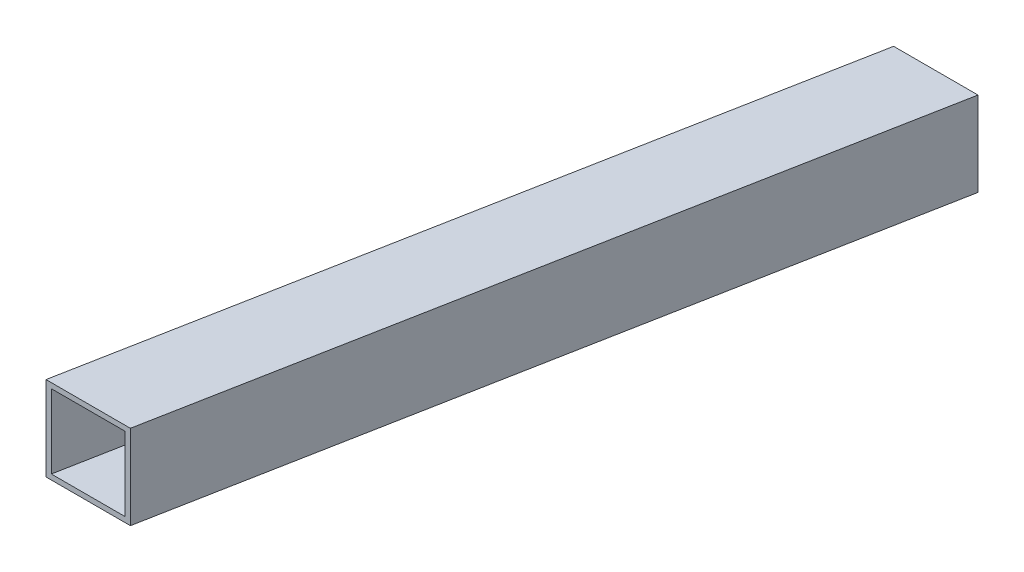
ISO-10303-21;
HEADER;
FILE_DESCRIPTION(('STEP AP214'),'2;1');
FILE_NAME('part.step','',(''),(''),'','','');
FILE_SCHEMA(('AUTOMOTIVE_DESIGN { 1 0 10303 214 1 1 1 1 }'));
ENDSEC;
DATA;
#1=APPLICATION_CONTEXT('core data for automotive mechanical design processes');
#2=APPLICATION_PROTOCOL_DEFINITION('international standard','automotive_design',2000,#1);
#3=PRODUCT_CONTEXT('',#1,'mechanical');
#4=PRODUCT('Part','Part','',(#3));
#5=PRODUCT_RELATED_PRODUCT_CATEGORY('part','',(#4));
#6=PRODUCT_DEFINITION_FORMATION('','',#4);
#7=PRODUCT_DEFINITION_CONTEXT('part definition',#1,'design');
#8=PRODUCT_DEFINITION('design','',#6,#7);
#9=PRODUCT_DEFINITION_SHAPE('','',#8);
#10=(LENGTH_UNIT() NAMED_UNIT(*) SI_UNIT(.MILLI.,.METRE.));
#11=(NAMED_UNIT(*) PLANE_ANGLE_UNIT() SI_UNIT($,.RADIAN.));
#12=(NAMED_UNIT(*) SI_UNIT($,.STERADIAN.) SOLID_ANGLE_UNIT());
#13=UNCERTAINTY_MEASURE_WITH_UNIT(LENGTH_MEASURE(1.E-05),#10,'distance_accuracy_value','');
#14=(GEOMETRIC_REPRESENTATION_CONTEXT(3) GLOBAL_UNCERTAINTY_ASSIGNED_CONTEXT((#13)) GLOBAL_UNIT_ASSIGNED_CONTEXT((#10,
#11,#12)) REPRESENTATION_CONTEXT('',''));
#15=CARTESIAN_POINT('',(0.,0.,0.));
#16=DIRECTION('',(0.,0.,1.));
#17=DIRECTION('',(1.,0.,0.));
#18=AXIS2_PLACEMENT_3D('',#15,#16,#17);
#19=CARTESIAN_POINT('',(0.,28.575,15.3333333333333));
#20=DIRECTION('',(0.,0.,1.));
#21=DIRECTION('',(1.,0.,0.));
#22=AXIS2_PLACEMENT_3D('',#19,#20,#21);
#23=PLANE('',#22);
#24=DIRECTION('',(-1.,0.,0.));
#25=VECTOR('',#24,1.);
#26=CARTESIAN_POINT('',(0.,28.575,15.3333333333333));
#27=LINE('',#26,#25);
#28=CARTESIAN_POINT('',(23.5797190635769,28.575,15.3333333333333));
#29=VERTEX_POINT('',#28);
#30=CARTESIAN_POINT('',(-4.99528093642361,28.575,15.3333332720558));
#31=VERTEX_POINT('',#30);
#32=EDGE_CURVE('E9',#29,#31,#27,.T.);
#33=ORIENTED_EDGE('',*,*,#32,.F.);
#34=DIRECTION('',(0.,-1.,0.));
#35=VECTOR('',#34,1.);
#36=CARTESIAN_POINT('',(23.5797190635769,28.575,15.3333333333333));
#37=LINE('',#36,#35);
#38=CARTESIAN_POINT('',(23.5797190635769,0.,15.3333333333333));
#39=VERTEX_POINT('',#38);
#40=EDGE_CURVE('E78',#29,#39,#37,.T.);
#41=ORIENTED_EDGE('',*,*,#40,.T.);
#42=DIRECTION('',(-1.,0.,0.));
#43=VECTOR('',#42,1.);
#44=CARTESIAN_POINT('',(0.,0.,15.3333333333333));
#45=LINE('',#44,#43);
#46=CARTESIAN_POINT('',(-4.99528093642361,0.,15.3333332720558));
#47=VERTEX_POINT('',#46);
#48=EDGE_CURVE('E18',#39,#47,#45,.T.);
#49=ORIENTED_EDGE('',*,*,#48,.T.);
#50=DIRECTION('',(0.,-1.,0.));
#51=VECTOR('',#50,1.);
#52=CARTESIAN_POINT('',(-4.99528093642361,28.575,15.3333332720558));
#53=LINE('',#52,#51);
#54=EDGE_CURVE('E81',#31,#47,#53,.T.);
#55=ORIENTED_EDGE('',*,*,#54,.F.);
#56=EDGE_LOOP('',(#33,#41,#49,#55));
#57=FACE_BOUND('',#56,.T.);
#58=DIRECTION('',(0.,-1.,0.));
#59=VECTOR('',#58,1.);
#60=CARTESIAN_POINT('',(20.1764649129224,31.3083199784112,15.3333333333333));
#61=LINE('',#60,#59);
#62=CARTESIAN_POINT('',(20.1764649129224,26.801445,15.3333333333333));
#63=VERTEX_POINT('',#62);
#64=CARTESIAN_POINT('',(20.1764649129224,1.773555,15.3333333333333));
#65=VERTEX_POINT('',#64);
#66=EDGE_CURVE('E104',#63,#65,#61,.T.);
#67=ORIENTED_EDGE('',*,*,#66,.F.);
#68=DIRECTION('',(-1.,0.,0.));
#69=VECTOR('',#68,1.);
#70=CARTESIAN_POINT('',(0.,26.801445,15.3333333333333));
#71=LINE('',#70,#69);
#72=CARTESIAN_POINT('',(-3.19006414815196,26.801445,15.3333333333333));
#73=VERTEX_POINT('',#72);
#74=EDGE_CURVE('E122',#63,#73,#71,.T.);
#75=ORIENTED_EDGE('',*,*,#74,.T.);
#76=DIRECTION('',(0.,-1.,0.));
#77=VECTOR('',#76,1.);
#78=CARTESIAN_POINT('',(-3.19006414815196,28.575,15.3333333333333));
#79=LINE('',#78,#77);
#80=CARTESIAN_POINT('',(-3.19006414815196,1.773555,15.3333333333333));
#81=VERTEX_POINT('',#80);
#82=EDGE_CURVE('E106',#73,#81,#79,.T.);
#83=ORIENTED_EDGE('',*,*,#82,.T.);
#84=DIRECTION('',(-1.,0.,0.));
#85=VECTOR('',#84,1.);
#86=CARTESIAN_POINT('',(0.,1.773555,15.3333333333333));
#87=LINE('',#86,#85);
#88=EDGE_CURVE('E116',#65,#81,#87,.T.);
#89=ORIENTED_EDGE('',*,*,#88,.F.);
#90=EDGE_LOOP('',(#67,#75,#83,#89));
#91=FACE_BOUND('',#90,.T.);
#92=ADVANCED_FACE('F15',(#57,#91),#23,.F.);
#93=CARTESIAN_POINT('',(-50.7952792341041,28.575,256.643333272112));
#94=DIRECTION('',(0.,0.,-1.));
#95=DIRECTION('',(-1.,0.,0.));
#96=AXIS2_PLACEMENT_3D('',#93,#94,#95);
#97=PLANE('',#96);
#98=DIRECTION('',(1.,0.,0.));
#99=VECTOR('',#98,1.);
#100=CARTESIAN_POINT('',(-50.7952792341041,0.,256.643333272112));
#101=LINE('',#100,#99);
#102=CARTESIAN_POINT('',(-50.7952792341041,0.,256.643333272112));
#103=VERTEX_POINT('',#102);
#104=CARTESIAN_POINT('',(-22.2152792341041,0.,256.643333272112));
#105=VERTEX_POINT('',#104);
#106=EDGE_CURVE('E139',#103,#105,#101,.T.);
#107=ORIENTED_EDGE('',*,*,#106,.T.);
#108=DIRECTION('',(0.,-1.,0.));
#109=VECTOR('',#108,1.);
#110=CARTESIAN_POINT('',(-22.2152792341041,35.638089944361,256.643333272112));
#111=LINE('',#110,#109);
#112=CARTESIAN_POINT('',(-22.2152792341041,28.575,256.643333272112));
#113=VERTEX_POINT('',#112);
#114=EDGE_CURVE('E137',#113,#105,#111,.T.);
#115=ORIENTED_EDGE('',*,*,#114,.F.);
#116=DIRECTION('',(1.,0.,0.));
#117=VECTOR('',#116,1.);
#118=CARTESIAN_POINT('',(-50.7952792341041,28.575,256.643333272112));
#119=LINE('',#118,#117);
#120=CARTESIAN_POINT('',(-50.7952792341041,28.575,256.643333272112));
#121=VERTEX_POINT('',#120);
#122=EDGE_CURVE('E95',#121,#113,#119,.T.);
#123=ORIENTED_EDGE('',*,*,#122,.F.);
#124=DIRECTION('',(0.,-1.,0.));
#125=VECTOR('',#124,1.);
#126=CARTESIAN_POINT('',(-50.7952792341041,28.575,256.643333272112));
#127=LINE('',#126,#125);
#128=EDGE_CURVE('E141',#121,#103,#127,.T.);
#129=ORIENTED_EDGE('',*,*,#128,.T.);
#130=EDGE_LOOP('',(#107,#115,#123,#129));
#131=FACE_BOUND('',#130,.T.);
#132=DIRECTION('',(1.,0.,0.));
#133=VECTOR('',#132,1.);
#134=CARTESIAN_POINT('',(-50.7952792341041,1.773555,256.643333272112));
#135=LINE('',#134,#133);
#136=CARTESIAN_POINT('',(-48.9900624342022,1.773555,256.643333272112));
#137=VERTEX_POINT('',#136);
#138=CARTESIAN_POINT('',(-24.0183333847581,1.773555,256.643333272112));
#139=VERTEX_POINT('',#138);
#140=EDGE_CURVE('E114',#137,#139,#135,.T.);
#141=ORIENTED_EDGE('',*,*,#140,.F.);
#142=DIRECTION('',(0.,-1.,0.));
#143=VECTOR('',#142,1.);
#144=CARTESIAN_POINT('',(-48.9900624342022,28.575,256.643333272112));
#145=LINE('',#144,#143);
#146=CARTESIAN_POINT('',(-48.9900624342022,26.801445,256.643333272112));
#147=VERTEX_POINT('',#146);
#148=EDGE_CURVE('E113',#147,#137,#145,.T.);
#149=ORIENTED_EDGE('',*,*,#148,.F.);
#150=DIRECTION('',(1.,0.,0.));
#151=VECTOR('',#150,1.);
#152=CARTESIAN_POINT('',(-50.7952792341041,26.801445,256.643333272112));
#153=LINE('',#152,#151);
#154=CARTESIAN_POINT('',(-24.0183333847581,26.801445,256.643333272112));
#155=VERTEX_POINT('',#154);
#156=EDGE_CURVE('E110',#147,#155,#153,.T.);
#157=ORIENTED_EDGE('',*,*,#156,.T.);
#158=DIRECTION('',(0.,-1.,0.));
#159=VECTOR('',#158,1.);
#160=CARTESIAN_POINT('',(-24.0183333847581,28.575,256.643333272112));
#161=LINE('',#160,#159);
#162=EDGE_CURVE('E119',#155,#139,#161,.T.);
#163=ORIENTED_EDGE('',*,*,#162,.T.);
#164=EDGE_LOOP('',(#141,#149,#157,#163));
#165=FACE_BOUND('',#164,.T.);
#166=ADVANCED_FACE('F156',(#131,#165),#97,.F.);
#167=CARTESIAN_POINT('',(0.,28.575,0.));
#168=DIRECTION('',(0.,1.,0.));
#169=DIRECTION('',(0.,0.,1.));
#170=AXIS2_PLACEMENT_3D('',#167,#168,#169);
#171=PLANE('',#170);
#172=ORIENTED_EDGE('',*,*,#122,.T.);
#173=DIRECTION('',(-0.186448833495909,0.,0.982464672386755));
#174=VECTOR('',#173,1.);
#175=CARTESIAN_POINT('',(23.5797190635769,28.575,15.3333333333333));
#176=LINE('',#175,#174);
#177=EDGE_CURVE('E88',#29,#113,#176,.T.);
#178=ORIENTED_EDGE('',*,*,#177,.F.);
#179=ORIENTED_EDGE('',*,*,#32,.T.);
#180=DIRECTION('',(0.186468482567303,0.,-0.98246094324866));
#181=VECTOR('',#180,1.);
#182=CARTESIAN_POINT('',(-50.7952792341041,28.575,256.643333272112));
#183=LINE('',#182,#181);
#184=EDGE_CURVE('E131',#121,#31,#183,.T.);
#185=ORIENTED_EDGE('',*,*,#184,.F.);
#186=EDGE_LOOP('',(#172,#178,#179,#185));
#187=FACE_BOUND('',#186,.T.);
#188=ADVANCED_FACE('F94',(#187),#171,.T.);
#189=CARTESIAN_POINT('',(0.,0.,0.));
#190=DIRECTION('',(0.,1.,0.));
#191=DIRECTION('',(0.,0.,1.));
#192=AXIS2_PLACEMENT_3D('',#189,#190,#191);
#193=PLANE('',#192);
#194=ORIENTED_EDGE('',*,*,#48,.F.);
#195=DIRECTION('',(-0.186448833495909,0.,0.982464672386755));
#196=VECTOR('',#195,1.);
#197=CARTESIAN_POINT('',(23.5797190635769,0.,15.3333333333333));
#198=LINE('',#197,#196);
#199=EDGE_CURVE('E91',#39,#105,#198,.T.);
#200=ORIENTED_EDGE('',*,*,#199,.T.);
#201=ORIENTED_EDGE('',*,*,#106,.F.);
#202=DIRECTION('',(0.186468482567303,0.,-0.98246094324866));
#203=VECTOR('',#202,1.);
#204=CARTESIAN_POINT('',(-50.7952792341041,0.,256.643333272112));
#205=LINE('',#204,#203);
#206=EDGE_CURVE('E125',#103,#47,#205,.T.);
#207=ORIENTED_EDGE('',*,*,#206,.T.);
#208=EDGE_LOOP('',(#194,#200,#201,#207));
#209=FACE_BOUND('',#208,.T.);
#210=ADVANCED_FACE('F155',(#209),#193,.F.);
#211=CARTESIAN_POINT('',(-50.7952792341041,28.575,256.643333272112));
#212=DIRECTION('',(-0.98246094324866,0.,-0.186468482567303));
#213=DIRECTION('',(-0.186468482567303,0.,0.98246094324866));
#214=AXIS2_PLACEMENT_3D('',#211,#212,#213);
#215=PLANE('',#214);
#216=ORIENTED_EDGE('',*,*,#206,.F.);
#217=ORIENTED_EDGE('',*,*,#128,.F.);
#218=ORIENTED_EDGE('',*,*,#184,.T.);
#219=ORIENTED_EDGE('',*,*,#54,.T.);
#220=EDGE_LOOP('',(#216,#217,#218,#219));
#221=FACE_BOUND('',#220,.T.);
#222=ADVANCED_FACE('F154',(#221),#215,.T.);
#223=CARTESIAN_POINT('',(0.,26.801445,0.));
#224=DIRECTION('',(0.,1.,0.));
#225=DIRECTION('',(0.,0.,1.));
#226=AXIS2_PLACEMENT_3D('',#223,#224,#225);
#227=PLANE('',#226);
#228=ORIENTED_EDGE('',*,*,#156,.F.);
#229=DIRECTION('',(0.186468482567303,0.,-0.98246094324866));
#230=VECTOR('',#229,1.);
#231=CARTESIAN_POINT('',(-49.0528307159007,26.801445,256.974045381711));
#232=LINE('',#231,#230);
#233=EDGE_CURVE('E29',#147,#73,#232,.T.);
#234=ORIENTED_EDGE('',*,*,#233,.T.);
#235=ORIENTED_EDGE('',*,*,#74,.F.);
#236=DIRECTION('',(0.180148946869504,0.,-0.983639342920874));
#237=VECTOR('',#236,1.);
#238=CARTESIAN_POINT('',(22.2387561956036,26.801445,4.07292422487815));
#239=LINE('',#238,#237);
#240=EDGE_CURVE('E101',#155,#63,#239,.T.);
#241=ORIENTED_EDGE('',*,*,#240,.F.);
#242=EDGE_LOOP('',(#228,#234,#235,#241));
#243=FACE_BOUND('',#242,.T.);
#244=ADVANCED_FACE('F169',(#243),#227,.F.);
#245=CARTESIAN_POINT('',(0.,1.773555,0.));
#246=DIRECTION('',(0.,1.,0.));
#247=DIRECTION('',(0.,0.,1.));
#248=AXIS2_PLACEMENT_3D('',#245,#246,#247);
#249=PLANE('',#248);
#250=DIRECTION('',(-0.180148946869504,0.,0.983639342920874));
#251=VECTOR('',#250,1.);
#252=CARTESIAN_POINT('',(20.2349805887424,1.773555,15.0138292678682));
#253=LINE('',#252,#251);
#254=EDGE_CURVE('E92',#65,#139,#253,.T.);
#255=ORIENTED_EDGE('',*,*,#254,.F.);
#256=ORIENTED_EDGE('',*,*,#88,.T.);
#257=DIRECTION('',(0.186468482567303,0.,-0.98246094324866));
#258=VECTOR('',#257,1.);
#259=CARTESIAN_POINT('',(-49.0528307159007,1.773555,256.974045381711));
#260=LINE('',#259,#258);
#261=EDGE_CURVE('E103',#137,#81,#260,.T.);
#262=ORIENTED_EDGE('',*,*,#261,.F.);
#263=ORIENTED_EDGE('',*,*,#140,.T.);
#264=EDGE_LOOP('',(#255,#256,#262,#263));
#265=FACE_BOUND('',#264,.T.);
#266=ADVANCED_FACE('F165',(#265),#249,.T.);
#267=CARTESIAN_POINT('',(-49.0528307159007,28.575,256.974045381711));
#268=DIRECTION('',(-0.98246094324866,0.,-0.186468482567303));
#269=DIRECTION('',(-0.186468482567303,0.,0.98246094324866));
#270=AXIS2_PLACEMENT_3D('',#267,#268,#269);
#271=PLANE('',#270);
#272=ORIENTED_EDGE('',*,*,#261,.T.);
#273=ORIENTED_EDGE('',*,*,#82,.F.);
#274=ORIENTED_EDGE('',*,*,#233,.F.);
#275=ORIENTED_EDGE('',*,*,#148,.T.);
#276=EDGE_LOOP('',(#272,#273,#274,#275));
#277=FACE_BOUND('',#276,.T.);
#278=ADVANCED_FACE('F167',(#277),#271,.F.);
#279=CARTESIAN_POINT('',(20.2349805887424,31.3083199784112,15.0138292678682));
#280=DIRECTION('',(0.983639342920874,0.,0.180148946869504));
#281=DIRECTION('',(0.180148946869504,0.,-0.983639342920874));
#282=AXIS2_PLACEMENT_3D('',#279,#280,#281);
#283=PLANE('',#282);
#284=ORIENTED_EDGE('',*,*,#162,.F.);
#285=ORIENTED_EDGE('',*,*,#240,.T.);
#286=ORIENTED_EDGE('',*,*,#66,.T.);
#287=ORIENTED_EDGE('',*,*,#254,.T.);
#288=EDGE_LOOP('',(#284,#285,#286,#287));
#289=FACE_BOUND('',#288,.T.);
#290=ADVANCED_FACE('F171',(#289),#283,.F.);
#291=CARTESIAN_POINT('',(23.5797190635769,28.575,15.3333333333333));
#292=DIRECTION('',(0.982464672386755,0.,0.186448833495909));
#293=DIRECTION('',(0.186448833495909,0.,-0.982464672386755));
#294=AXIS2_PLACEMENT_3D('',#291,#292,#293);
#295=PLANE('',#294);
#296=ORIENTED_EDGE('',*,*,#199,.F.);
#297=ORIENTED_EDGE('',*,*,#40,.F.);
#298=ORIENTED_EDGE('',*,*,#177,.T.);
#299=ORIENTED_EDGE('',*,*,#114,.T.);
#300=EDGE_LOOP('',(#296,#297,#298,#299));
#301=FACE_BOUND('',#300,.T.);
#302=ADVANCED_FACE('F87',(#301),#295,.T.);
#303=CLOSED_SHELL('',(#92,#166,#188,#210,#222,#244,#266,#278,#290,#302));
#304=MANIFOLD_SOLID_BREP('B1',#303);
#305=ADVANCED_BREP_SHAPE_REPRESENTATION('',(#18,#304),#14);
#306=SHAPE_DEFINITION_REPRESENTATION(#9,#305);
ENDSEC;
END-ISO-10303-21;
